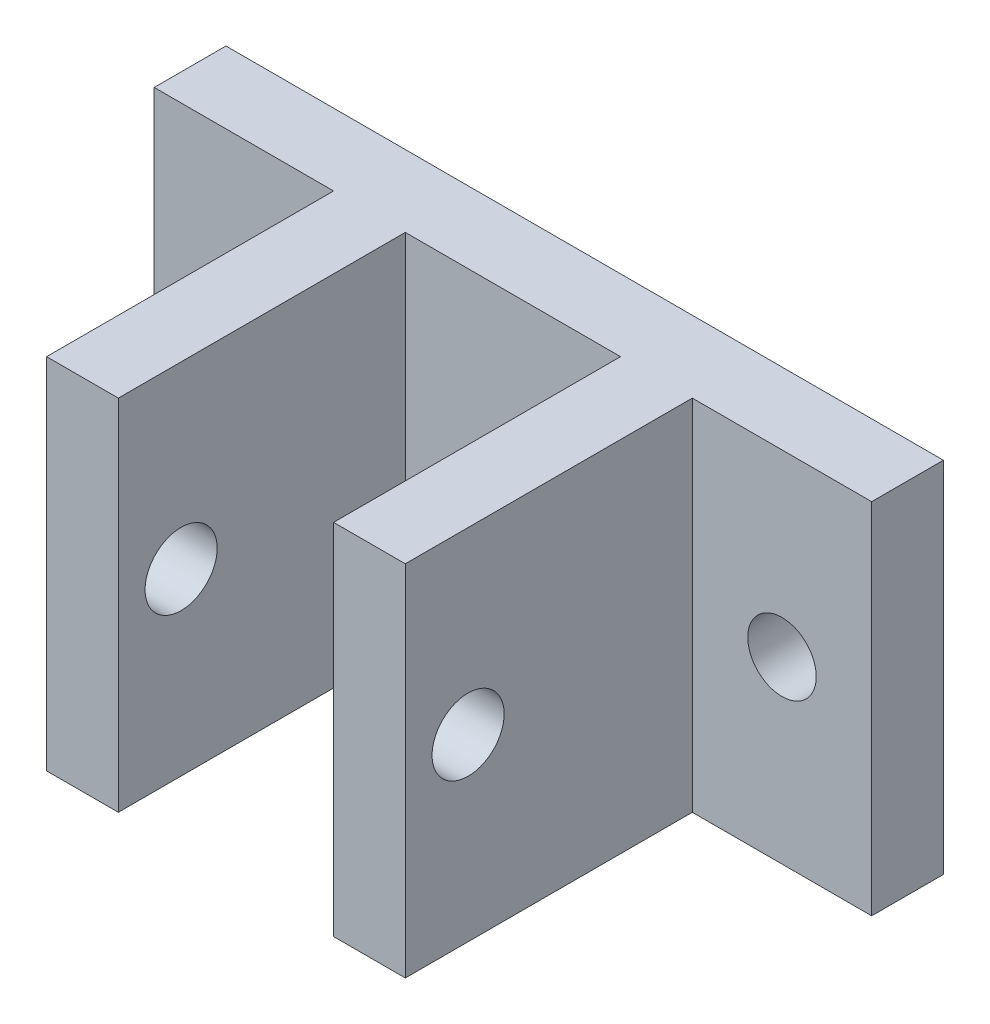
ISO-10303-21;
HEADER;
FILE_DESCRIPTION(('STEP AP214'),'2;1');
FILE_NAME('part.step','',(''),(''),'','','');
FILE_SCHEMA(('AUTOMOTIVE_DESIGN { 1 0 10303 214 1 1 1 1 }'));
ENDSEC;
DATA;
#1=APPLICATION_CONTEXT('core data for automotive mechanical design processes');
#2=APPLICATION_PROTOCOL_DEFINITION('international standard','automotive_design',2000,#1);
#3=PRODUCT_CONTEXT('',#1,'mechanical');
#4=PRODUCT('Part','Part','',(#3));
#5=PRODUCT_RELATED_PRODUCT_CATEGORY('part','',(#4));
#6=PRODUCT_DEFINITION_FORMATION('','',#4);
#7=PRODUCT_DEFINITION_CONTEXT('part definition',#1,'design');
#8=PRODUCT_DEFINITION('design','',#6,#7);
#9=PRODUCT_DEFINITION_SHAPE('','',#8);
#10=(LENGTH_UNIT() NAMED_UNIT(*) SI_UNIT(.MILLI.,.METRE.));
#11=(NAMED_UNIT(*) PLANE_ANGLE_UNIT() SI_UNIT($,.RADIAN.));
#12=(NAMED_UNIT(*) SI_UNIT($,.STERADIAN.) SOLID_ANGLE_UNIT());
#13=UNCERTAINTY_MEASURE_WITH_UNIT(LENGTH_MEASURE(1.E-05),#10,'distance_accuracy_value','');
#14=(GEOMETRIC_REPRESENTATION_CONTEXT(3) GLOBAL_UNCERTAINTY_ASSIGNED_CONTEXT((#13)) GLOBAL_UNIT_ASSIGNED_CONTEXT((#10,
#11,#12)) REPRESENTATION_CONTEXT('',''));
#15=CARTESIAN_POINT('',(0.,0.,0.));
#16=DIRECTION('',(0.,0.,1.));
#17=DIRECTION('',(1.,0.,0.));
#18=AXIS2_PLACEMENT_3D('',#15,#16,#17);
#19=CARTESIAN_POINT('',(25.4,12.7,5.08));
#20=DIRECTION('',(0.,0.,1.));
#21=DIRECTION('',(1.,0.,0.));
#22=AXIS2_PLACEMENT_3D('',#19,#20,#21);
#23=PLANE('',#22);
#24=CARTESIAN_POINT('',(6.35,12.7,5.08));
#25=DIRECTION('',(0.,0.,1.));
#26=DIRECTION('',(1.,0.,0.));
#27=AXIS2_PLACEMENT_3D('',#24,#25,#26);
#28=CIRCLE('',#27,2.4257);
#29=CARTESIAN_POINT('',(8.7757,12.7,5.08));
#30=VERTEX_POINT('',#29);
#31=EDGE_CURVE('E177',#30,#30,#28,.T.);
#32=ORIENTED_EDGE('',*,*,#31,.F.);
#33=EDGE_LOOP('',(#32));
#34=FACE_BOUND('',#33,.T.);
#35=DIRECTION('',(1.,0.,0.));
#36=VECTOR('',#35,1.);
#37=CARTESIAN_POINT('',(6.35,0.,5.08));
#38=LINE('',#37,#36);
#39=CARTESIAN_POINT('',(0.,0.,5.08));
#40=VERTEX_POINT('',#39);
#41=CARTESIAN_POINT('',(12.7,0.,5.08));
#42=VERTEX_POINT('',#41);
#43=EDGE_CURVE('E170',#40,#42,#38,.T.);
#44=ORIENTED_EDGE('',*,*,#43,.T.);
#45=DIRECTION('',(0.,1.,0.));
#46=VECTOR('',#45,1.);
#47=CARTESIAN_POINT('',(12.7,12.7,5.08));
#48=LINE('',#47,#46);
#49=CARTESIAN_POINT('',(12.7,25.4,5.08));
#50=VERTEX_POINT('',#49);
#51=EDGE_CURVE('E11',#42,#50,#48,.T.);
#52=ORIENTED_EDGE('',*,*,#51,.T.);
#53=DIRECTION('',(1.,0.,0.));
#54=VECTOR('',#53,1.);
#55=CARTESIAN_POINT('',(6.35,25.4,5.08));
#56=LINE('',#55,#54);
#57=CARTESIAN_POINT('',(0.,25.4,5.08));
#58=VERTEX_POINT('',#57);
#59=EDGE_CURVE('E175',#58,#50,#56,.T.);
#60=ORIENTED_EDGE('',*,*,#59,.F.);
#61=DIRECTION('',(0.,1.,0.));
#62=VECTOR('',#61,1.);
#63=CARTESIAN_POINT('',(0.,12.7,5.08));
#64=LINE('',#63,#62);
#65=EDGE_CURVE('E165',#40,#58,#64,.T.);
#66=ORIENTED_EDGE('',*,*,#65,.F.);
#67=EDGE_LOOP('',(#44,#52,#60,#66));
#68=FACE_BOUND('',#67,.T.);
#69=ADVANCED_FACE('F17',(#34,#68),#23,.T.);
#70=CARTESIAN_POINT('',(17.78,25.4,5.08));
#71=VERTEX_POINT('',#70);
#72=CARTESIAN_POINT('',(33.02,25.4,5.08));
#73=VERTEX_POINT('',#72);
#74=EDGE_CURVE('E178',#71,#73,#56,.T.);
#75=ORIENTED_EDGE('',*,*,#74,.F.);
#76=DIRECTION('',(0.,-1.,0.));
#77=VECTOR('',#76,1.);
#78=CARTESIAN_POINT('',(17.78,12.7,5.08));
#79=LINE('',#78,#77);
#80=CARTESIAN_POINT('',(17.78,0.,5.08));
#81=VERTEX_POINT('',#80);
#82=EDGE_CURVE('E26',#71,#81,#79,.T.);
#83=ORIENTED_EDGE('',*,*,#82,.T.);
#84=CARTESIAN_POINT('',(33.02,0.,5.08));
#85=VERTEX_POINT('',#84);
#86=EDGE_CURVE('E174',#81,#85,#38,.T.);
#87=ORIENTED_EDGE('',*,*,#86,.T.);
#88=DIRECTION('',(0.,-1.,0.));
#89=VECTOR('',#88,1.);
#90=CARTESIAN_POINT('',(33.02,12.7,5.08));
#91=LINE('',#90,#89);
#92=EDGE_CURVE('E33',#73,#85,#91,.T.);
#93=ORIENTED_EDGE('',*,*,#92,.F.);
#94=EDGE_LOOP('',(#75,#83,#87,#93));
#95=FACE_BOUND('',#94,.T.);
#96=ADVANCED_FACE('F213',(#95),#23,.T.);
#97=CARTESIAN_POINT('',(0.,12.7,5.08));
#98=DIRECTION('',(-1.,0.,0.));
#99=DIRECTION('',(0.,0.,1.));
#100=AXIS2_PLACEMENT_3D('',#97,#98,#99);
#101=PLANE('',#100);
#102=DIRECTION('',(0.,1.,0.));
#103=VECTOR('',#102,1.);
#104=CARTESIAN_POINT('',(0.,12.7,0.));
#105=LINE('',#104,#103);
#106=CARTESIAN_POINT('',(0.,0.,0.));
#107=VERTEX_POINT('',#106);
#108=CARTESIAN_POINT('',(0.,25.4,0.));
#109=VERTEX_POINT('',#108);
#110=EDGE_CURVE('E137',#107,#109,#105,.T.);
#111=ORIENTED_EDGE('',*,*,#110,.F.);
#112=DIRECTION('',(0.,0.,-1.));
#113=VECTOR('',#112,1.);
#114=CARTESIAN_POINT('',(0.,0.,5.08));
#115=LINE('',#114,#113);
#116=EDGE_CURVE('E207',#40,#107,#115,.T.);
#117=ORIENTED_EDGE('',*,*,#116,.F.);
#118=ORIENTED_EDGE('',*,*,#65,.T.);
#119=DIRECTION('',(0.,0.,-1.));
#120=VECTOR('',#119,1.);
#121=CARTESIAN_POINT('',(0.,25.4,5.08));
#122=LINE('',#121,#120);
#123=EDGE_CURVE('E187',#58,#109,#122,.T.);
#124=ORIENTED_EDGE('',*,*,#123,.T.);
#125=EDGE_LOOP('',(#111,#117,#118,#124));
#126=FACE_BOUND('',#125,.T.);
#127=ADVANCED_FACE('F19',(#126),#101,.T.);
#128=CARTESIAN_POINT('',(6.35,0.,5.08));
#129=DIRECTION('',(0.,1.,0.));
#130=DIRECTION('',(0.,0.,1.));
#131=AXIS2_PLACEMENT_3D('',#128,#129,#130);
#132=PLANE('',#131);
#133=CARTESIAN_POINT('',(38.1,0.,5.08));
#134=VERTEX_POINT('',#133);
#135=CARTESIAN_POINT('',(50.8,0.,5.08));
#136=VERTEX_POINT('',#135);
#137=EDGE_CURVE('E168',#134,#136,#38,.T.);
#138=ORIENTED_EDGE('',*,*,#137,.F.);
#139=DIRECTION('',(0.,0.,-1.));
#140=VECTOR('',#139,1.);
#141=CARTESIAN_POINT('',(38.1,0.,25.4));
#142=LINE('',#141,#140);
#143=CARTESIAN_POINT('',(38.1,0.,25.4));
#144=VERTEX_POINT('',#143);
#145=EDGE_CURVE('E160',#144,#134,#142,.T.);
#146=ORIENTED_EDGE('',*,*,#145,.F.);
#147=DIRECTION('',(1.,0.,0.));
#148=VECTOR('',#147,1.);
#149=CARTESIAN_POINT('',(35.56,0.,25.4));
#150=LINE('',#149,#148);
#151=CARTESIAN_POINT('',(33.02,0.,25.4));
#152=VERTEX_POINT('',#151);
#153=EDGE_CURVE('E145',#152,#144,#150,.T.);
#154=ORIENTED_EDGE('',*,*,#153,.F.);
#155=DIRECTION('',(0.,0.,-1.));
#156=VECTOR('',#155,1.);
#157=CARTESIAN_POINT('',(33.02,0.,25.4));
#158=LINE('',#157,#156);
#159=EDGE_CURVE('E117',#152,#85,#158,.T.);
#160=ORIENTED_EDGE('',*,*,#159,.T.);
#161=ORIENTED_EDGE('',*,*,#86,.F.);
#162=DIRECTION('',(0.,0.,-1.));
#163=VECTOR('',#162,1.);
#164=CARTESIAN_POINT('',(17.78,0.,25.4));
#165=LINE('',#164,#163);
#166=CARTESIAN_POINT('',(17.78,0.,25.4));
#167=VERTEX_POINT('',#166);
#168=EDGE_CURVE('E124',#167,#81,#165,.T.);
#169=ORIENTED_EDGE('',*,*,#168,.F.);
#170=DIRECTION('',(1.,0.,0.));
#171=VECTOR('',#170,1.);
#172=CARTESIAN_POINT('',(15.24,0.,25.4));
#173=LINE('',#172,#171);
#174=CARTESIAN_POINT('',(12.7,0.,25.4));
#175=VERTEX_POINT('',#174);
#176=EDGE_CURVE('E114',#175,#167,#173,.T.);
#177=ORIENTED_EDGE('',*,*,#176,.F.);
#178=DIRECTION('',(0.,0.,-1.));
#179=VECTOR('',#178,1.);
#180=CARTESIAN_POINT('',(12.7,0.,25.4));
#181=LINE('',#180,#179);
#182=EDGE_CURVE('E138',#175,#42,#181,.T.);
#183=ORIENTED_EDGE('',*,*,#182,.T.);
#184=ORIENTED_EDGE('',*,*,#43,.F.);
#185=ORIENTED_EDGE('',*,*,#116,.T.);
#186=DIRECTION('',(1.,0.,0.));
#187=VECTOR('',#186,1.);
#188=CARTESIAN_POINT('',(6.35,0.,0.));
#189=LINE('',#188,#187);
#190=CARTESIAN_POINT('',(50.8,0.,0.));
#191=VERTEX_POINT('',#190);
#192=EDGE_CURVE('E190',#107,#191,#189,.T.);
#193=ORIENTED_EDGE('',*,*,#192,.T.);
#194=DIRECTION('',(0.,0.,-1.));
#195=VECTOR('',#194,1.);
#196=CARTESIAN_POINT('',(50.8,0.,5.08));
#197=LINE('',#196,#195);
#198=EDGE_CURVE('E204',#136,#191,#197,.T.);
#199=ORIENTED_EDGE('',*,*,#198,.F.);
#200=EDGE_LOOP('',(#138,#146,#154,#160,#161,#169,#177,#183,#184,#185,#193,#199));
#201=FACE_BOUND('',#200,.T.);
#202=ADVANCED_FACE('F215',(#201),#132,.F.);
#203=CARTESIAN_POINT('',(50.8,12.7,5.08));
#204=DIRECTION('',(-1.,0.,0.));
#205=DIRECTION('',(0.,-1.,0.));
#206=AXIS2_PLACEMENT_3D('',#203,#204,#205);
#207=PLANE('',#206);
#208=DIRECTION('',(0.,1.,0.));
#209=VECTOR('',#208,1.);
#210=CARTESIAN_POINT('',(50.8,12.7,0.));
#211=LINE('',#210,#209);
#212=CARTESIAN_POINT('',(50.8,25.4,0.));
#213=VERTEX_POINT('',#212);
#214=EDGE_CURVE('E169',#191,#213,#211,.T.);
#215=ORIENTED_EDGE('',*,*,#214,.T.);
#216=DIRECTION('',(0.,0.,-1.));
#217=VECTOR('',#216,1.);
#218=CARTESIAN_POINT('',(50.8,25.4,5.08));
#219=LINE('',#218,#217);
#220=CARTESIAN_POINT('',(50.8,25.4,5.08));
#221=VERTEX_POINT('',#220);
#222=EDGE_CURVE('E202',#221,#213,#219,.T.);
#223=ORIENTED_EDGE('',*,*,#222,.F.);
#224=DIRECTION('',(0.,1.,0.));
#225=VECTOR('',#224,1.);
#226=CARTESIAN_POINT('',(50.8,12.7,5.08));
#227=LINE('',#226,#225);
#228=EDGE_CURVE('E184',#136,#221,#227,.T.);
#229=ORIENTED_EDGE('',*,*,#228,.F.);
#230=ORIENTED_EDGE('',*,*,#198,.T.);
#231=EDGE_LOOP('',(#215,#223,#229,#230));
#232=FACE_BOUND('',#231,.T.);
#233=ADVANCED_FACE('F226',(#232),#207,.F.);
#234=CARTESIAN_POINT('',(6.35,12.7,5.08));
#235=DIRECTION('',(0.,0.,-1.));
#236=DIRECTION('',(-1.,0.,0.));
#237=AXIS2_PLACEMENT_3D('',#234,#235,#236);
#238=CYLINDRICAL_SURFACE('',#237,2.4257);
#239=ORIENTED_EDGE('',*,*,#31,.T.);
#240=EDGE_LOOP('',(#239));
#241=FACE_BOUND('',#240,.T.);
#242=CARTESIAN_POINT('',(6.35,12.7,0.));
#243=DIRECTION('',(0.,0.,1.));
#244=DIRECTION('',(1.,0.,0.));
#245=AXIS2_PLACEMENT_3D('',#242,#243,#244);
#246=CIRCLE('',#245,2.4257);
#247=CARTESIAN_POINT('',(8.7757,12.7,0.));
#248=VERTEX_POINT('',#247);
#249=EDGE_CURVE('E194',#248,#248,#246,.T.);
#250=ORIENTED_EDGE('',*,*,#249,.F.);
#251=EDGE_LOOP('',(#250));
#252=FACE_BOUND('',#251,.T.);
#253=ADVANCED_FACE('F272',(#241,#252),#238,.F.);
#254=CARTESIAN_POINT('',(6.35,25.4,5.08));
#255=DIRECTION('',(0.,1.,0.));
#256=DIRECTION('',(0.,0.,1.));
#257=AXIS2_PLACEMENT_3D('',#254,#255,#256);
#258=PLANE('',#257);
#259=ORIENTED_EDGE('',*,*,#222,.T.);
#260=DIRECTION('',(1.,0.,0.));
#261=VECTOR('',#260,1.);
#262=CARTESIAN_POINT('',(6.35,25.4,0.));
#263=LINE('',#262,#261);
#264=EDGE_CURVE('E192',#109,#213,#263,.T.);
#265=ORIENTED_EDGE('',*,*,#264,.F.);
#266=ORIENTED_EDGE('',*,*,#123,.F.);
#267=ORIENTED_EDGE('',*,*,#59,.T.);
#268=DIRECTION('',(0.,0.,-1.));
#269=VECTOR('',#268,1.);
#270=CARTESIAN_POINT('',(12.7,25.4,25.4));
#271=LINE('',#270,#269);
#272=CARTESIAN_POINT('',(12.7,25.4,25.4));
#273=VERTEX_POINT('',#272);
#274=EDGE_CURVE('E129',#273,#50,#271,.T.);
#275=ORIENTED_EDGE('',*,*,#274,.F.);
#276=DIRECTION('',(1.,0.,0.));
#277=VECTOR('',#276,1.);
#278=CARTESIAN_POINT('',(15.24,25.4,25.4));
#279=LINE('',#278,#277);
#280=CARTESIAN_POINT('',(17.78,25.4,25.4));
#281=VERTEX_POINT('',#280);
#282=EDGE_CURVE('E112',#273,#281,#279,.T.);
#283=ORIENTED_EDGE('',*,*,#282,.T.);
#284=DIRECTION('',(0.,0.,-1.));
#285=VECTOR('',#284,1.);
#286=CARTESIAN_POINT('',(17.78,25.4,25.4));
#287=LINE('',#286,#285);
#288=EDGE_CURVE('E120',#281,#71,#287,.T.);
#289=ORIENTED_EDGE('',*,*,#288,.T.);
#290=ORIENTED_EDGE('',*,*,#74,.T.);
#291=DIRECTION('',(0.,0.,-1.));
#292=VECTOR('',#291,1.);
#293=CARTESIAN_POINT('',(33.02,25.4,25.4));
#294=LINE('',#293,#292);
#295=CARTESIAN_POINT('',(33.02,25.4,25.4));
#296=VERTEX_POINT('',#295);
#297=EDGE_CURVE('E154',#296,#73,#294,.T.);
#298=ORIENTED_EDGE('',*,*,#297,.F.);
#299=DIRECTION('',(1.,0.,0.));
#300=VECTOR('',#299,1.);
#301=CARTESIAN_POINT('',(35.56,25.4,25.4));
#302=LINE('',#301,#300);
#303=CARTESIAN_POINT('',(38.1,25.4,25.4));
#304=VERTEX_POINT('',#303);
#305=EDGE_CURVE('E151',#296,#304,#302,.T.);
#306=ORIENTED_EDGE('',*,*,#305,.T.);
#307=DIRECTION('',(0.,0.,-1.));
#308=VECTOR('',#307,1.);
#309=CARTESIAN_POINT('',(38.1,25.4,25.4));
#310=LINE('',#309,#308);
#311=CARTESIAN_POINT('',(38.1,25.4,5.08));
#312=VERTEX_POINT('',#311);
#313=EDGE_CURVE('E157',#304,#312,#310,.T.);
#314=ORIENTED_EDGE('',*,*,#313,.T.);
#315=EDGE_CURVE('E173',#312,#221,#56,.T.);
#316=ORIENTED_EDGE('',*,*,#315,.T.);
#317=EDGE_LOOP('',(#259,#265,#266,#267,#275,#283,#289,#290,#298,#306,#314,#316));
#318=FACE_BOUND('',#317,.T.);
#319=ADVANCED_FACE('F127',(#318),#258,.T.);
#320=CARTESIAN_POINT('',(44.45,12.7,5.08));
#321=DIRECTION('',(0.,0.,-1.));
#322=DIRECTION('',(-1.,0.,0.));
#323=AXIS2_PLACEMENT_3D('',#320,#321,#322);
#324=CYLINDRICAL_SURFACE('',#323,2.4257);
#325=CARTESIAN_POINT('',(44.45,12.7,5.08));
#326=DIRECTION('',(0.,0.,1.));
#327=DIRECTION('',(1.,0.,0.));
#328=AXIS2_PLACEMENT_3D('',#325,#326,#327);
#329=CIRCLE('',#328,2.4257);
#330=CARTESIAN_POINT('',(46.8757,12.7,5.08));
#331=VERTEX_POINT('',#330);
#332=EDGE_CURVE('E181',#331,#331,#329,.T.);
#333=ORIENTED_EDGE('',*,*,#332,.T.);
#334=EDGE_LOOP('',(#333));
#335=FACE_BOUND('',#334,.T.);
#336=CARTESIAN_POINT('',(44.45,12.7,0.));
#337=DIRECTION('',(0.,0.,1.));
#338=DIRECTION('',(1.,0.,0.));
#339=AXIS2_PLACEMENT_3D('',#336,#337,#338);
#340=CIRCLE('',#339,2.4257);
#341=CARTESIAN_POINT('',(46.8757,12.7,0.));
#342=VERTEX_POINT('',#341);
#343=EDGE_CURVE('E197',#342,#342,#340,.T.);
#344=ORIENTED_EDGE('',*,*,#343,.F.);
#345=EDGE_LOOP('',(#344));
#346=FACE_BOUND('',#345,.T.);
#347=ADVANCED_FACE('F261',(#335,#346),#324,.F.);
#348=DIRECTION('',(0.,1.,0.));
#349=VECTOR('',#348,1.);
#350=CARTESIAN_POINT('',(38.1,12.7,5.08));
#351=LINE('',#350,#349);
#352=EDGE_CURVE('E41',#134,#312,#351,.T.);
#353=ORIENTED_EDGE('',*,*,#352,.F.);
#354=ORIENTED_EDGE('',*,*,#137,.T.);
#355=ORIENTED_EDGE('',*,*,#228,.T.);
#356=ORIENTED_EDGE('',*,*,#315,.F.);
#357=EDGE_LOOP('',(#353,#354,#355,#356));
#358=FACE_BOUND('',#357,.T.);
#359=ORIENTED_EDGE('',*,*,#332,.F.);
#360=EDGE_LOOP('',(#359));
#361=FACE_BOUND('',#360,.T.);
#362=ADVANCED_FACE('F218',(#358,#361),#23,.T.);
#363=CARTESIAN_POINT('',(25.4,12.7,0.));
#364=DIRECTION('',(0.,0.,1.));
#365=DIRECTION('',(1.,0.,0.));
#366=AXIS2_PLACEMENT_3D('',#363,#364,#365);
#367=PLANE('',#366);
#368=ORIENTED_EDGE('',*,*,#214,.F.);
#369=ORIENTED_EDGE('',*,*,#192,.F.);
#370=ORIENTED_EDGE('',*,*,#110,.T.);
#371=ORIENTED_EDGE('',*,*,#264,.T.);
#372=EDGE_LOOP('',(#368,#369,#370,#371));
#373=FACE_BOUND('',#372,.T.);
#374=ORIENTED_EDGE('',*,*,#343,.T.);
#375=EDGE_LOOP('',(#374));
#376=FACE_BOUND('',#375,.T.);
#377=ORIENTED_EDGE('',*,*,#249,.T.);
#378=EDGE_LOOP('',(#377));
#379=FACE_BOUND('',#378,.T.);
#380=ADVANCED_FACE('F247',(#373,#376,#379),#367,.F.);
#381=CARTESIAN_POINT('',(33.02,12.7,25.4));
#382=DIRECTION('',(-1.,0.,0.));
#383=DIRECTION('',(0.,0.,1.));
#384=AXIS2_PLACEMENT_3D('',#381,#382,#383);
#385=PLANE('',#384);
#386=CARTESIAN_POINT('',(33.02,12.7,20.955));
#387=DIRECTION('',(-1.,0.,0.));
#388=DIRECTION('',(0.,0.,1.));
#389=AXIS2_PLACEMENT_3D('',#386,#387,#388);
#390=CIRCLE('',#389,2.5527);
#391=CARTESIAN_POINT('',(33.02,12.7,23.5077));
#392=VERTEX_POINT('',#391);
#393=EDGE_CURVE('E146',#392,#392,#390,.T.);
#394=ORIENTED_EDGE('',*,*,#393,.F.);
#395=EDGE_LOOP('',(#394));
#396=FACE_BOUND('',#395,.T.);
#397=ORIENTED_EDGE('',*,*,#297,.T.);
#398=ORIENTED_EDGE('',*,*,#92,.T.);
#399=ORIENTED_EDGE('',*,*,#159,.F.);
#400=DIRECTION('',(0.,1.,0.));
#401=VECTOR('',#400,1.);
#402=CARTESIAN_POINT('',(33.02,12.7,25.4));
#403=LINE('',#402,#401);
#404=EDGE_CURVE('E142',#152,#296,#403,.T.);
#405=ORIENTED_EDGE('',*,*,#404,.T.);
#406=EDGE_LOOP('',(#397,#398,#399,#405));
#407=FACE_BOUND('',#406,.T.);
#408=ADVANCED_FACE('F229',(#396,#407),#385,.T.);
#409=CARTESIAN_POINT('',(38.1,12.7,25.4));
#410=DIRECTION('',(1.,0.,0.));
#411=DIRECTION('',(0.,0.,-1.));
#412=AXIS2_PLACEMENT_3D('',#409,#410,#411);
#413=PLANE('',#412);
#414=CARTESIAN_POINT('',(38.1,12.7,20.955));
#415=DIRECTION('',(1.,0.,0.));
#416=DIRECTION('',(0.,0.,-1.));
#417=AXIS2_PLACEMENT_3D('',#414,#415,#416);
#418=CIRCLE('',#417,2.5527);
#419=CARTESIAN_POINT('',(38.1,12.7,18.4023));
#420=VERTEX_POINT('',#419);
#421=EDGE_CURVE('E301',#420,#420,#418,.T.);
#422=ORIENTED_EDGE('',*,*,#421,.F.);
#423=EDGE_LOOP('',(#422));
#424=FACE_BOUND('',#423,.T.);
#425=ORIENTED_EDGE('',*,*,#145,.T.);
#426=ORIENTED_EDGE('',*,*,#352,.T.);
#427=ORIENTED_EDGE('',*,*,#313,.F.);
#428=DIRECTION('',(0.,-1.,0.));
#429=VECTOR('',#428,1.);
#430=CARTESIAN_POINT('',(38.1,12.7,25.4));
#431=LINE('',#430,#429);
#432=EDGE_CURVE('E148',#304,#144,#431,.T.);
#433=ORIENTED_EDGE('',*,*,#432,.T.);
#434=EDGE_LOOP('',(#425,#426,#427,#433));
#435=FACE_BOUND('',#434,.T.);
#436=ADVANCED_FACE('F236',(#424,#435),#413,.T.);
#437=CARTESIAN_POINT('',(25.4,12.7,25.4));
#438=DIRECTION('',(0.,0.,1.));
#439=DIRECTION('',(1.,0.,0.));
#440=AXIS2_PLACEMENT_3D('',#437,#438,#439);
#441=PLANE('',#440);
#442=ORIENTED_EDGE('',*,*,#404,.F.);
#443=ORIENTED_EDGE('',*,*,#153,.T.);
#444=ORIENTED_EDGE('',*,*,#432,.F.);
#445=ORIENTED_EDGE('',*,*,#305,.F.);
#446=EDGE_LOOP('',(#442,#443,#444,#445));
#447=FACE_BOUND('',#446,.T.);
#448=ADVANCED_FACE('F234',(#447),#441,.T.);
#449=CARTESIAN_POINT('',(12.7,12.7,25.4));
#450=DIRECTION('',(1.,0.,0.));
#451=DIRECTION('',(0.,1.,0.));
#452=AXIS2_PLACEMENT_3D('',#449,#450,#451);
#453=PLANE('',#452);
#454=CARTESIAN_POINT('',(12.7,12.7,20.955));
#455=DIRECTION('',(1.,0.,0.));
#456=DIRECTION('',(0.,0.,-1.));
#457=AXIS2_PLACEMENT_3D('',#454,#455,#456);
#458=CIRCLE('',#457,2.5527);
#459=CARTESIAN_POINT('',(12.7,12.7,18.4023));
#460=VERTEX_POINT('',#459);
#461=EDGE_CURVE('E304',#460,#460,#458,.T.);
#462=ORIENTED_EDGE('',*,*,#461,.T.);
#463=EDGE_LOOP('',(#462));
#464=FACE_BOUND('',#463,.T.);
#465=ORIENTED_EDGE('',*,*,#51,.F.);
#466=ORIENTED_EDGE('',*,*,#182,.F.);
#467=DIRECTION('',(0.,-1.,0.));
#468=VECTOR('',#467,1.);
#469=CARTESIAN_POINT('',(12.7,12.7,25.4));
#470=LINE('',#469,#468);
#471=EDGE_CURVE('E131',#273,#175,#470,.T.);
#472=ORIENTED_EDGE('',*,*,#471,.F.);
#473=ORIENTED_EDGE('',*,*,#274,.T.);
#474=EDGE_LOOP('',(#465,#466,#472,#473));
#475=FACE_BOUND('',#474,.T.);
#476=ADVANCED_FACE('F245',(#464,#475),#453,.F.);
#477=CARTESIAN_POINT('',(17.78,12.7,25.4));
#478=DIRECTION('',(-1.,0.,0.));
#479=DIRECTION('',(0.,0.,1.));
#480=AXIS2_PLACEMENT_3D('',#477,#478,#479);
#481=PLANE('',#480);
#482=CARTESIAN_POINT('',(17.78,12.7,20.955));
#483=DIRECTION('',(-1.,0.,0.));
#484=DIRECTION('',(0.,0.,1.));
#485=AXIS2_PLACEMENT_3D('',#482,#483,#484);
#486=CIRCLE('',#485,2.5527);
#487=CARTESIAN_POINT('',(17.78,12.7,23.5077));
#488=VERTEX_POINT('',#487);
#489=EDGE_CURVE('E21',#488,#488,#486,.T.);
#490=ORIENTED_EDGE('',*,*,#489,.T.);
#491=EDGE_LOOP('',(#490));
#492=FACE_BOUND('',#491,.T.);
#493=ORIENTED_EDGE('',*,*,#82,.F.);
#494=ORIENTED_EDGE('',*,*,#288,.F.);
#495=DIRECTION('',(0.,1.,0.));
#496=VECTOR('',#495,1.);
#497=CARTESIAN_POINT('',(17.78,12.7,25.4));
#498=LINE('',#497,#496);
#499=EDGE_CURVE('E108',#167,#281,#498,.T.);
#500=ORIENTED_EDGE('',*,*,#499,.F.);
#501=ORIENTED_EDGE('',*,*,#168,.T.);
#502=EDGE_LOOP('',(#493,#494,#500,#501));
#503=FACE_BOUND('',#502,.T.);
#504=ADVANCED_FACE('F121',(#492,#503),#481,.F.);
#505=CARTESIAN_POINT('',(25.4,12.7,25.4));
#506=DIRECTION('',(0.,0.,1.));
#507=DIRECTION('',(1.,0.,0.));
#508=AXIS2_PLACEMENT_3D('',#505,#506,#507);
#509=PLANE('',#508);
#510=ORIENTED_EDGE('',*,*,#282,.F.);
#511=ORIENTED_EDGE('',*,*,#471,.T.);
#512=ORIENTED_EDGE('',*,*,#176,.T.);
#513=ORIENTED_EDGE('',*,*,#499,.T.);
#514=EDGE_LOOP('',(#510,#511,#512,#513));
#515=FACE_BOUND('',#514,.T.);
#516=ADVANCED_FACE('F110',(#515),#509,.T.);
#517=CARTESIAN_POINT('',(12.7,12.7,20.955));
#518=DIRECTION('',(1.,0.,0.));
#519=DIRECTION('',(0.,0.,-1.));
#520=AXIS2_PLACEMENT_3D('',#517,#518,#519);
#521=CYLINDRICAL_SURFACE('',#520,2.5527);
#522=ORIENTED_EDGE('',*,*,#461,.F.);
#523=EDGE_LOOP('',(#522));
#524=FACE_BOUND('',#523,.T.);
#525=ORIENTED_EDGE('',*,*,#489,.F.);
#526=EDGE_LOOP('',(#525));
#527=FACE_BOUND('',#526,.T.);
#528=ADVANCED_FACE('F312',(#524,#527),#521,.F.);
#529=ORIENTED_EDGE('',*,*,#393,.T.);
#530=EDGE_LOOP('',(#529));
#531=FACE_BOUND('',#530,.T.);
#532=ORIENTED_EDGE('',*,*,#421,.T.);
#533=EDGE_LOOP('',(#532));
#534=FACE_BOUND('',#533,.T.);
#535=ADVANCED_FACE('F314',(#531,#534),#521,.F.);
#536=CLOSED_SHELL('',(#69,#96,#127,#202,#233,#253,#319,#347,#362,#380,#408,#436,#448,#476,#504,
#516,#528,#535));
#537=MANIFOLD_SOLID_BREP('B1',#536);
#538=ADVANCED_BREP_SHAPE_REPRESENTATION('',(#18,#537),#14);
#539=SHAPE_DEFINITION_REPRESENTATION(#9,#538);
ENDSEC;
END-ISO-10303-21;
